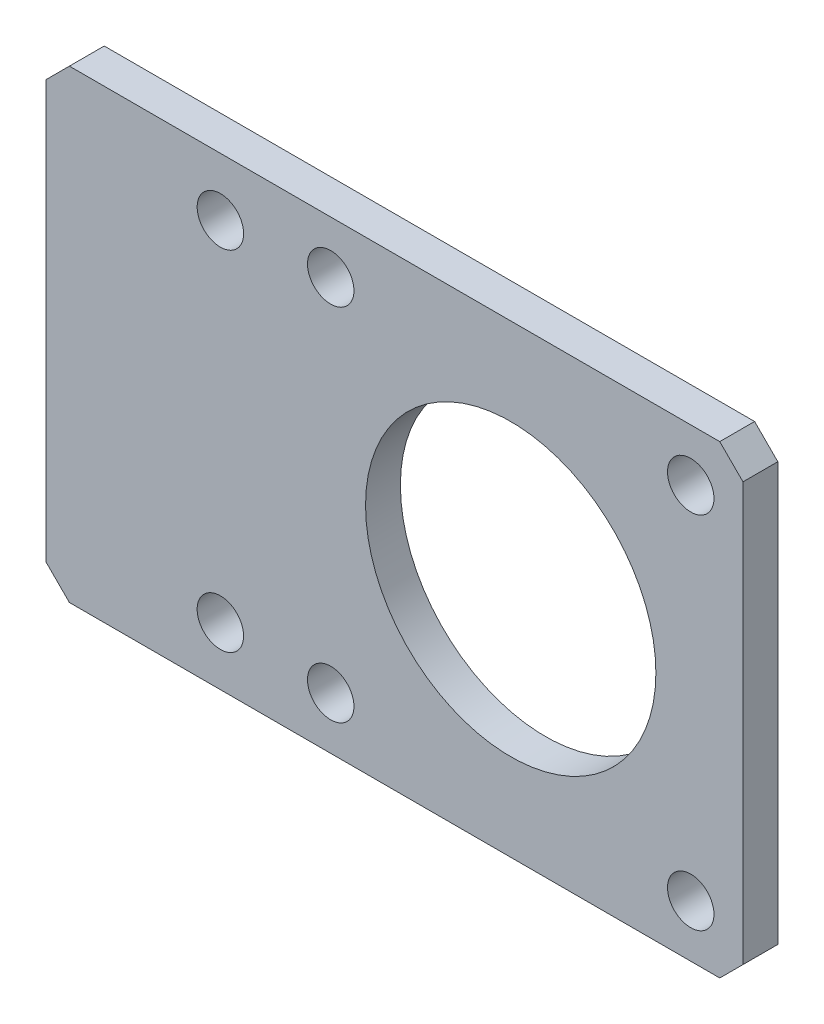
ISO-10303-21;
HEADER;
FILE_DESCRIPTION(('STEP AP214'),'2;1');
FILE_NAME('part.step','',(''),(''),'','','');
FILE_SCHEMA(('AUTOMOTIVE_DESIGN { 1 0 10303 214 1 1 1 1 }'));
ENDSEC;
DATA;
#1=APPLICATION_CONTEXT('core data for automotive mechanical design processes');
#2=APPLICATION_PROTOCOL_DEFINITION('international standard','automotive_design',2000,#1);
#3=PRODUCT_CONTEXT('',#1,'mechanical');
#4=PRODUCT('Part','Part','',(#3));
#5=PRODUCT_RELATED_PRODUCT_CATEGORY('part','',(#4));
#6=PRODUCT_DEFINITION_FORMATION('','',#4);
#7=PRODUCT_DEFINITION_CONTEXT('part definition',#1,'design');
#8=PRODUCT_DEFINITION('design','',#6,#7);
#9=PRODUCT_DEFINITION_SHAPE('','',#8);
#10=(LENGTH_UNIT() NAMED_UNIT(*) SI_UNIT(.MILLI.,.METRE.));
#11=(NAMED_UNIT(*) PLANE_ANGLE_UNIT() SI_UNIT($,.RADIAN.));
#12=(NAMED_UNIT(*) SI_UNIT($,.STERADIAN.) SOLID_ANGLE_UNIT());
#13=UNCERTAINTY_MEASURE_WITH_UNIT(LENGTH_MEASURE(1.E-05),#10,'distance_accuracy_value','');
#14=(GEOMETRIC_REPRESENTATION_CONTEXT(3) GLOBAL_UNCERTAINTY_ASSIGNED_CONTEXT((#13)) GLOBAL_UNIT_ASSIGNED_CONTEXT((#10,
#11,#12)) REPRESENTATION_CONTEXT('',''));
#15=CARTESIAN_POINT('',(0.,0.,0.));
#16=DIRECTION('',(0.,0.,1.));
#17=DIRECTION('',(1.,0.,0.));
#18=AXIS2_PLACEMENT_3D('',#15,#16,#17);
#19=CARTESIAN_POINT('',(0.,0.,3.));
#20=DIRECTION('',(1.,0.,0.));
#21=DIRECTION('',(0.,0.,-1.));
#22=AXIS2_PLACEMENT_3D('',#19,#20,#21);
#23=PLANE('',#22);
#24=DIRECTION('',(0.,-1.,0.));
#25=VECTOR('',#24,1.);
#26=CARTESIAN_POINT('',(0.,0.,0.));
#27=LINE('',#26,#25);
#28=CARTESIAN_POINT('',(0.,38.,0.));
#29=VERTEX_POINT('',#28);
#30=CARTESIAN_POINT('',(0.,2.00000000000001,0.));
#31=VERTEX_POINT('',#30);
#32=EDGE_CURVE('E125',#29,#31,#27,.T.);
#33=ORIENTED_EDGE('',*,*,#32,.T.);
#34=DIRECTION('',(0.,0.,1.));
#35=VECTOR('',#34,1.);
#36=CARTESIAN_POINT('',(0.,2.00000000000001,3.));
#37=LINE('',#36,#35);
#38=CARTESIAN_POINT('',(0.,2.00000000000001,3.));
#39=VERTEX_POINT('',#38);
#40=EDGE_CURVE('E103',#31,#39,#37,.T.);
#41=ORIENTED_EDGE('',*,*,#40,.T.);
#42=DIRECTION('',(0.,-1.,0.));
#43=VECTOR('',#42,1.);
#44=CARTESIAN_POINT('',(0.,0.,3.));
#45=LINE('',#44,#43);
#46=CARTESIAN_POINT('',(0.,38.,3.));
#47=VERTEX_POINT('',#46);
#48=EDGE_CURVE('E135',#47,#39,#45,.T.);
#49=ORIENTED_EDGE('',*,*,#48,.F.);
#50=DIRECTION('',(0.,0.,-1.));
#51=VECTOR('',#50,1.);
#52=CARTESIAN_POINT('',(0.,38.,3.));
#53=LINE('',#52,#51);
#54=EDGE_CURVE('E108',#47,#29,#53,.T.);
#55=ORIENTED_EDGE('',*,*,#54,.T.);
#56=EDGE_LOOP('',(#33,#41,#49,#55));
#57=FACE_BOUND('',#56,.T.);
#58=ADVANCED_FACE('F32',(#57),#23,.F.);
#59=CARTESIAN_POINT('',(0.,0.,3.));
#60=DIRECTION('',(0.,1.,0.));
#61=DIRECTION('',(0.,0.,1.));
#62=AXIS2_PLACEMENT_3D('',#59,#60,#61);
#63=PLANE('',#62);
#64=DIRECTION('',(1.,0.,0.));
#65=VECTOR('',#64,1.);
#66=CARTESIAN_POINT('',(0.,0.,3.));
#67=LINE('',#66,#65);
#68=CARTESIAN_POINT('',(1.99999999999999,0.,3.));
#69=VERTEX_POINT('',#68);
#70=CARTESIAN_POINT('',(58.,0.,3.));
#71=VERTEX_POINT('',#70);
#72=EDGE_CURVE('E118',#69,#71,#67,.T.);
#73=ORIENTED_EDGE('',*,*,#72,.F.);
#74=DIRECTION('',(0.,0.,-1.));
#75=VECTOR('',#74,1.);
#76=CARTESIAN_POINT('',(1.99999999999999,0.,3.));
#77=LINE('',#76,#75);
#78=CARTESIAN_POINT('',(1.99999999999999,0.,0.));
#79=VERTEX_POINT('',#78);
#80=EDGE_CURVE('E102',#69,#79,#77,.T.);
#81=ORIENTED_EDGE('',*,*,#80,.T.);
#82=DIRECTION('',(1.,0.,0.));
#83=VECTOR('',#82,1.);
#84=CARTESIAN_POINT('',(0.,0.,0.));
#85=LINE('',#84,#83);
#86=CARTESIAN_POINT('',(58.,0.,0.));
#87=VERTEX_POINT('',#86);
#88=EDGE_CURVE('E115',#79,#87,#85,.T.);
#89=ORIENTED_EDGE('',*,*,#88,.T.);
#90=DIRECTION('',(0.,0.,1.));
#91=VECTOR('',#90,1.);
#92=CARTESIAN_POINT('',(58.,0.,3.));
#93=LINE('',#92,#91);
#94=EDGE_CURVE('E120',#87,#71,#93,.T.);
#95=ORIENTED_EDGE('',*,*,#94,.T.);
#96=EDGE_LOOP('',(#73,#81,#89,#95));
#97=FACE_BOUND('',#96,.T.);
#98=ADVANCED_FACE('F114',(#97),#63,.F.);
#99=CARTESIAN_POINT('',(60.,0.,3.));
#100=DIRECTION('',(-1.,0.,0.));
#101=DIRECTION('',(0.,-1.,0.));
#102=AXIS2_PLACEMENT_3D('',#99,#100,#101);
#103=PLANE('',#102);
#104=DIRECTION('',(0.,1.,0.));
#105=VECTOR('',#104,1.);
#106=CARTESIAN_POINT('',(60.,0.,3.));
#107=LINE('',#106,#105);
#108=CARTESIAN_POINT('',(60.,1.99999999999999,3.));
#109=VERTEX_POINT('',#108);
#110=CARTESIAN_POINT('',(60.,38.,3.));
#111=VERTEX_POINT('',#110);
#112=EDGE_CURVE('E161',#109,#111,#107,.T.);
#113=ORIENTED_EDGE('',*,*,#112,.F.);
#114=DIRECTION('',(0.,0.,-1.));
#115=VECTOR('',#114,1.);
#116=CARTESIAN_POINT('',(60.,1.99999999999999,3.));
#117=LINE('',#116,#115);
#118=CARTESIAN_POINT('',(60.,2.00000000000001,0.));
#119=VERTEX_POINT('',#118);
#120=EDGE_CURVE('E154',#109,#119,#117,.T.);
#121=ORIENTED_EDGE('',*,*,#120,.T.);
#122=DIRECTION('',(0.,1.,0.));
#123=VECTOR('',#122,1.);
#124=CARTESIAN_POINT('',(60.,0.,0.));
#125=LINE('',#124,#123);
#126=CARTESIAN_POINT('',(60.,38.,0.));
#127=VERTEX_POINT('',#126);
#128=EDGE_CURVE('E124',#119,#127,#125,.T.);
#129=ORIENTED_EDGE('',*,*,#128,.T.);
#130=DIRECTION('',(0.,0.,1.));
#131=VECTOR('',#130,1.);
#132=CARTESIAN_POINT('',(60.,38.,3.));
#133=LINE('',#132,#131);
#134=EDGE_CURVE('E152',#127,#111,#133,.T.);
#135=ORIENTED_EDGE('',*,*,#134,.T.);
#136=EDGE_LOOP('',(#113,#121,#129,#135));
#137=FACE_BOUND('',#136,.T.);
#138=ADVANCED_FACE('F159',(#137),#103,.F.);
#139=CARTESIAN_POINT('',(0.,40.,3.));
#140=DIRECTION('',(0.,-1.,0.));
#141=DIRECTION('',(0.,0.,-1.));
#142=AXIS2_PLACEMENT_3D('',#139,#140,#141);
#143=PLANE('',#142);
#144=DIRECTION('',(-1.,0.,0.));
#145=VECTOR('',#144,1.);
#146=CARTESIAN_POINT('',(0.,40.,3.));
#147=LINE('',#146,#145);
#148=CARTESIAN_POINT('',(58.,40.,3.));
#149=VERTEX_POINT('',#148);
#150=CARTESIAN_POINT('',(2.00000000000002,40.,3.));
#151=VERTEX_POINT('',#150);
#152=EDGE_CURVE('E136',#149,#151,#147,.T.);
#153=ORIENTED_EDGE('',*,*,#152,.F.);
#154=DIRECTION('',(0.,0.,-1.));
#155=VECTOR('',#154,1.);
#156=CARTESIAN_POINT('',(58.,40.,3.));
#157=LINE('',#156,#155);
#158=CARTESIAN_POINT('',(58.,40.,0.));
#159=VERTEX_POINT('',#158);
#160=EDGE_CURVE('E11',#149,#159,#157,.T.);
#161=ORIENTED_EDGE('',*,*,#160,.T.);
#162=DIRECTION('',(-1.,0.,0.));
#163=VECTOR('',#162,1.);
#164=CARTESIAN_POINT('',(0.,40.,0.));
#165=LINE('',#164,#163);
#166=CARTESIAN_POINT('',(2.00000000000001,40.,0.));
#167=VERTEX_POINT('',#166);
#168=EDGE_CURVE('E128',#159,#167,#165,.T.);
#169=ORIENTED_EDGE('',*,*,#168,.T.);
#170=DIRECTION('',(0.,0.,1.));
#171=VECTOR('',#170,1.);
#172=CARTESIAN_POINT('',(2.00000000000002,40.,3.));
#173=LINE('',#172,#171);
#174=EDGE_CURVE('E40',#167,#151,#173,.T.);
#175=ORIENTED_EDGE('',*,*,#174,.T.);
#176=EDGE_LOOP('',(#153,#161,#169,#175));
#177=FACE_BOUND('',#176,.T.);
#178=ADVANCED_FACE('F168',(#177),#143,.F.);
#179=CARTESIAN_POINT('',(0.,0.,3.));
#180=DIRECTION('',(0.,0.,-1.));
#181=DIRECTION('',(-1.,0.,0.));
#182=AXIS2_PLACEMENT_3D('',#179,#180,#181);
#183=PLANE('',#182);
#184=CARTESIAN_POINT('',(15.,5.,3.));
#185=DIRECTION('',(0.,0.,1.));
#186=DIRECTION('',(1.,0.,0.));
#187=AXIS2_PLACEMENT_3D('',#184,#185,#186);
#188=CIRCLE('',#187,2.);
#189=CARTESIAN_POINT('',(17.,5.,3.));
#190=VERTEX_POINT('',#189);
#191=EDGE_CURVE('E211',#190,#190,#188,.T.);
#192=ORIENTED_EDGE('',*,*,#191,.F.);
#193=EDGE_LOOP('',(#192));
#194=FACE_BOUND('',#193,.T.);
#195=CARTESIAN_POINT('',(15.,35.,3.));
#196=DIRECTION('',(0.,0.,1.));
#197=DIRECTION('',(1.,0.,0.));
#198=AXIS2_PLACEMENT_3D('',#195,#196,#197);
#199=CIRCLE('',#198,2.);
#200=CARTESIAN_POINT('',(17.,35.,3.));
#201=VERTEX_POINT('',#200);
#202=EDGE_CURVE('E205',#201,#201,#199,.T.);
#203=ORIENTED_EDGE('',*,*,#202,.F.);
#204=EDGE_LOOP('',(#203));
#205=FACE_BOUND('',#204,.T.);
#206=CARTESIAN_POINT('',(40.,20.,3.));
#207=DIRECTION('',(0.,0.,1.));
#208=DIRECTION('',(1.,0.,0.));
#209=AXIS2_PLACEMENT_3D('',#206,#207,#208);
#210=CIRCLE('',#209,12.5);
#211=CARTESIAN_POINT('',(52.5,20.,3.));
#212=VERTEX_POINT('',#211);
#213=EDGE_CURVE('E199',#212,#212,#210,.T.);
#214=ORIENTED_EDGE('',*,*,#213,.F.);
#215=EDGE_LOOP('',(#214));
#216=FACE_BOUND('',#215,.T.);
#217=CARTESIAN_POINT('',(24.5,4.5,3.));
#218=DIRECTION('',(0.,0.,1.));
#219=DIRECTION('',(1.,0.,0.));
#220=AXIS2_PLACEMENT_3D('',#217,#218,#219);
#221=CIRCLE('',#220,2.);
#222=CARTESIAN_POINT('',(26.5,4.5,3.));
#223=VERTEX_POINT('',#222);
#224=EDGE_CURVE('E193',#223,#223,#221,.T.);
#225=ORIENTED_EDGE('',*,*,#224,.F.);
#226=EDGE_LOOP('',(#225));
#227=FACE_BOUND('',#226,.T.);
#228=CARTESIAN_POINT('',(55.5,4.5,3.));
#229=DIRECTION('',(0.,0.,1.));
#230=DIRECTION('',(1.,0.,0.));
#231=AXIS2_PLACEMENT_3D('',#228,#229,#230);
#232=CIRCLE('',#231,2.);
#233=CARTESIAN_POINT('',(57.5,4.5,3.));
#234=VERTEX_POINT('',#233);
#235=EDGE_CURVE('E187',#234,#234,#232,.T.);
#236=ORIENTED_EDGE('',*,*,#235,.F.);
#237=EDGE_LOOP('',(#236));
#238=FACE_BOUND('',#237,.T.);
#239=CARTESIAN_POINT('',(55.5,35.5,3.));
#240=DIRECTION('',(0.,0.,1.));
#241=DIRECTION('',(1.,0.,0.));
#242=AXIS2_PLACEMENT_3D('',#239,#240,#241);
#243=CIRCLE('',#242,2.);
#244=CARTESIAN_POINT('',(57.5,35.5,3.));
#245=VERTEX_POINT('',#244);
#246=EDGE_CURVE('E181',#245,#245,#243,.T.);
#247=ORIENTED_EDGE('',*,*,#246,.F.);
#248=EDGE_LOOP('',(#247));
#249=FACE_BOUND('',#248,.T.);
#250=CARTESIAN_POINT('',(24.5,35.5,3.));
#251=DIRECTION('',(0.,0.,1.));
#252=DIRECTION('',(1.,0.,0.));
#253=AXIS2_PLACEMENT_3D('',#250,#251,#252);
#254=CIRCLE('',#253,2.);
#255=CARTESIAN_POINT('',(26.5,35.5,3.));
#256=VERTEX_POINT('',#255);
#257=EDGE_CURVE('E175',#256,#256,#254,.T.);
#258=ORIENTED_EDGE('',*,*,#257,.F.);
#259=EDGE_LOOP('',(#258));
#260=FACE_BOUND('',#259,.T.);
#261=ORIENTED_EDGE('',*,*,#48,.T.);
#262=DIRECTION('',(-0.707106781186545,0.70710678118655,0.));
#263=VECTOR('',#262,1.);
#264=CARTESIAN_POINT('',(1.99999999999999,0.,3.));
#265=LINE('',#264,#263);
#266=EDGE_CURVE('E150',#39,#69,#265,.F.);
#267=ORIENTED_EDGE('',*,*,#266,.T.);
#268=ORIENTED_EDGE('',*,*,#72,.T.);
#269=DIRECTION('',(-0.70710678118655,-0.707106781186545,0.));
#270=VECTOR('',#269,1.);
#271=CARTESIAN_POINT('',(60.,1.99999999999999,3.));
#272=LINE('',#271,#270);
#273=EDGE_CURVE('E148',#71,#109,#272,.F.);
#274=ORIENTED_EDGE('',*,*,#273,.T.);
#275=ORIENTED_EDGE('',*,*,#112,.T.);
#276=DIRECTION('',(0.707106781186546,-0.707106781186549,0.));
#277=VECTOR('',#276,1.);
#278=CARTESIAN_POINT('',(58.,40.,3.));
#279=LINE('',#278,#277);
#280=EDGE_CURVE('E53',#111,#149,#279,.F.);
#281=ORIENTED_EDGE('',*,*,#280,.T.);
#282=ORIENTED_EDGE('',*,*,#152,.T.);
#283=DIRECTION('',(0.707106781186549,0.707106781186546,0.));
#284=VECTOR('',#283,1.);
#285=CARTESIAN_POINT('',(0.,38.,3.));
#286=LINE('',#285,#284);
#287=EDGE_CURVE('E145',#151,#47,#286,.F.);
#288=ORIENTED_EDGE('',*,*,#287,.T.);
#289=EDGE_LOOP('',(#261,#267,#268,#274,#275,#281,#282,#288));
#290=FACE_BOUND('',#289,.T.);
#291=ADVANCED_FACE('F226',(#194,#205,#216,#227,#238,#249,#260,#290),#183,.F.);
#292=CARTESIAN_POINT('',(0.,0.,0.));
#293=DIRECTION('',(0.,0.,-1.));
#294=DIRECTION('',(-1.,0.,0.));
#295=AXIS2_PLACEMENT_3D('',#292,#293,#294);
#296=PLANE('',#295);
#297=CARTESIAN_POINT('',(15.,5.,0.));
#298=DIRECTION('',(0.,0.,1.));
#299=DIRECTION('',(1.,0.,0.));
#300=AXIS2_PLACEMENT_3D('',#297,#298,#299);
#301=CIRCLE('',#300,2.);
#302=CARTESIAN_POINT('',(17.,5.,0.));
#303=VERTEX_POINT('',#302);
#304=EDGE_CURVE('E208',#303,#303,#301,.T.);
#305=ORIENTED_EDGE('',*,*,#304,.T.);
#306=EDGE_LOOP('',(#305));
#307=FACE_BOUND('',#306,.T.);
#308=CARTESIAN_POINT('',(15.,35.,0.));
#309=DIRECTION('',(0.,0.,1.));
#310=DIRECTION('',(1.,0.,0.));
#311=AXIS2_PLACEMENT_3D('',#308,#309,#310);
#312=CIRCLE('',#311,2.);
#313=CARTESIAN_POINT('',(17.,35.,0.));
#314=VERTEX_POINT('',#313);
#315=EDGE_CURVE('E202',#314,#314,#312,.T.);
#316=ORIENTED_EDGE('',*,*,#315,.T.);
#317=EDGE_LOOP('',(#316));
#318=FACE_BOUND('',#317,.T.);
#319=CARTESIAN_POINT('',(40.,20.,0.));
#320=DIRECTION('',(0.,0.,1.));
#321=DIRECTION('',(1.,0.,0.));
#322=AXIS2_PLACEMENT_3D('',#319,#320,#321);
#323=CIRCLE('',#322,12.5);
#324=CARTESIAN_POINT('',(52.5,20.,0.));
#325=VERTEX_POINT('',#324);
#326=EDGE_CURVE('E196',#325,#325,#323,.T.);
#327=ORIENTED_EDGE('',*,*,#326,.T.);
#328=EDGE_LOOP('',(#327));
#329=FACE_BOUND('',#328,.T.);
#330=CARTESIAN_POINT('',(24.5,4.5,0.));
#331=DIRECTION('',(0.,0.,1.));
#332=DIRECTION('',(1.,0.,0.));
#333=AXIS2_PLACEMENT_3D('',#330,#331,#332);
#334=CIRCLE('',#333,2.);
#335=CARTESIAN_POINT('',(26.5,4.5,0.));
#336=VERTEX_POINT('',#335);
#337=EDGE_CURVE('E190',#336,#336,#334,.T.);
#338=ORIENTED_EDGE('',*,*,#337,.T.);
#339=EDGE_LOOP('',(#338));
#340=FACE_BOUND('',#339,.T.);
#341=CARTESIAN_POINT('',(55.5,4.5,0.));
#342=DIRECTION('',(0.,0.,1.));
#343=DIRECTION('',(1.,0.,0.));
#344=AXIS2_PLACEMENT_3D('',#341,#342,#343);
#345=CIRCLE('',#344,2.);
#346=CARTESIAN_POINT('',(57.5,4.5,0.));
#347=VERTEX_POINT('',#346);
#348=EDGE_CURVE('E184',#347,#347,#345,.T.);
#349=ORIENTED_EDGE('',*,*,#348,.T.);
#350=EDGE_LOOP('',(#349));
#351=FACE_BOUND('',#350,.T.);
#352=CARTESIAN_POINT('',(55.5,35.5,0.));
#353=DIRECTION('',(0.,0.,1.));
#354=DIRECTION('',(1.,0.,0.));
#355=AXIS2_PLACEMENT_3D('',#352,#353,#354);
#356=CIRCLE('',#355,2.);
#357=CARTESIAN_POINT('',(57.5,35.5,0.));
#358=VERTEX_POINT('',#357);
#359=EDGE_CURVE('E178',#358,#358,#356,.T.);
#360=ORIENTED_EDGE('',*,*,#359,.T.);
#361=EDGE_LOOP('',(#360));
#362=FACE_BOUND('',#361,.T.);
#363=CARTESIAN_POINT('',(24.5,35.5,0.));
#364=DIRECTION('',(0.,0.,1.));
#365=DIRECTION('',(1.,0.,0.));
#366=AXIS2_PLACEMENT_3D('',#363,#364,#365);
#367=CIRCLE('',#366,2.);
#368=CARTESIAN_POINT('',(26.5,35.5,0.));
#369=VERTEX_POINT('',#368);
#370=EDGE_CURVE('E130',#369,#369,#367,.T.);
#371=ORIENTED_EDGE('',*,*,#370,.T.);
#372=EDGE_LOOP('',(#371));
#373=FACE_BOUND('',#372,.T.);
#374=ORIENTED_EDGE('',*,*,#88,.F.);
#375=DIRECTION('',(0.707106781186545,-0.70710678118655,0.));
#376=VECTOR('',#375,1.);
#377=CARTESIAN_POINT('',(1.,0.999999999999997,0.));
#378=LINE('',#377,#376);
#379=EDGE_CURVE('E98',#79,#31,#378,.F.);
#380=ORIENTED_EDGE('',*,*,#379,.T.);
#381=ORIENTED_EDGE('',*,*,#32,.F.);
#382=DIRECTION('',(-0.707106781186549,-0.707106781186546,0.));
#383=VECTOR('',#382,1.);
#384=CARTESIAN_POINT('',(-19.,19.0000000000001,0.));
#385=LINE('',#384,#383);
#386=EDGE_CURVE('E119',#29,#167,#385,.F.);
#387=ORIENTED_EDGE('',*,*,#386,.T.);
#388=ORIENTED_EDGE('',*,*,#168,.F.);
#389=DIRECTION('',(-0.707106781186546,0.707106781186549,0.));
#390=VECTOR('',#389,1.);
#391=CARTESIAN_POINT('',(49.0000000000001,48.9999999999999,0.));
#392=LINE('',#391,#390);
#393=EDGE_CURVE('E139',#159,#127,#392,.F.);
#394=ORIENTED_EDGE('',*,*,#393,.T.);
#395=ORIENTED_EDGE('',*,*,#128,.F.);
#396=DIRECTION('',(0.70710678118655,0.707106781186545,0.));
#397=VECTOR('',#396,1.);
#398=CARTESIAN_POINT('',(28.9999999999998,-29.,0.));
#399=LINE('',#398,#397);
#400=EDGE_CURVE('E109',#119,#87,#399,.F.);
#401=ORIENTED_EDGE('',*,*,#400,.T.);
#402=EDGE_LOOP('',(#374,#380,#381,#387,#388,#394,#395,#401));
#403=FACE_BOUND('',#402,.T.);
#404=ADVANCED_FACE('F122',(#307,#318,#329,#340,#351,#362,#373,#403),#296,.T.);
#405=CARTESIAN_POINT('',(24.5,35.5,0.));
#406=DIRECTION('',(0.,0.,1.));
#407=DIRECTION('',(1.,0.,0.));
#408=AXIS2_PLACEMENT_3D('',#405,#406,#407);
#409=CYLINDRICAL_SURFACE('',#408,2.);
#410=ORIENTED_EDGE('',*,*,#370,.F.);
#411=EDGE_LOOP('',(#410));
#412=FACE_BOUND('',#411,.T.);
#413=ORIENTED_EDGE('',*,*,#257,.T.);
#414=EDGE_LOOP('',(#413));
#415=FACE_BOUND('',#414,.T.);
#416=ADVANCED_FACE('F331',(#412,#415),#409,.F.);
#417=CARTESIAN_POINT('',(55.5,35.5,0.));
#418=DIRECTION('',(0.,0.,1.));
#419=DIRECTION('',(1.,0.,0.));
#420=AXIS2_PLACEMENT_3D('',#417,#418,#419);
#421=CYLINDRICAL_SURFACE('',#420,2.);
#422=ORIENTED_EDGE('',*,*,#359,.F.);
#423=EDGE_LOOP('',(#422));
#424=FACE_BOUND('',#423,.T.);
#425=ORIENTED_EDGE('',*,*,#246,.T.);
#426=EDGE_LOOP('',(#425));
#427=FACE_BOUND('',#426,.T.);
#428=ADVANCED_FACE('F322',(#424,#427),#421,.F.);
#429=CARTESIAN_POINT('',(55.5,4.5,0.));
#430=DIRECTION('',(0.,0.,1.));
#431=DIRECTION('',(1.,0.,0.));
#432=AXIS2_PLACEMENT_3D('',#429,#430,#431);
#433=CYLINDRICAL_SURFACE('',#432,2.);
#434=ORIENTED_EDGE('',*,*,#348,.F.);
#435=EDGE_LOOP('',(#434));
#436=FACE_BOUND('',#435,.T.);
#437=ORIENTED_EDGE('',*,*,#235,.T.);
#438=EDGE_LOOP('',(#437));
#439=FACE_BOUND('',#438,.T.);
#440=ADVANCED_FACE('F313',(#436,#439),#433,.F.);
#441=CARTESIAN_POINT('',(24.5,4.5,0.));
#442=DIRECTION('',(0.,0.,1.));
#443=DIRECTION('',(1.,0.,0.));
#444=AXIS2_PLACEMENT_3D('',#441,#442,#443);
#445=CYLINDRICAL_SURFACE('',#444,2.);
#446=ORIENTED_EDGE('',*,*,#337,.F.);
#447=EDGE_LOOP('',(#446));
#448=FACE_BOUND('',#447,.T.);
#449=ORIENTED_EDGE('',*,*,#224,.T.);
#450=EDGE_LOOP('',(#449));
#451=FACE_BOUND('',#450,.T.);
#452=ADVANCED_FACE('F304',(#448,#451),#445,.F.);
#453=CARTESIAN_POINT('',(40.,20.,0.));
#454=DIRECTION('',(0.,0.,1.));
#455=DIRECTION('',(1.,0.,0.));
#456=AXIS2_PLACEMENT_3D('',#453,#454,#455);
#457=CYLINDRICAL_SURFACE('',#456,12.5);
#458=ORIENTED_EDGE('',*,*,#326,.F.);
#459=EDGE_LOOP('',(#458));
#460=FACE_BOUND('',#459,.T.);
#461=ORIENTED_EDGE('',*,*,#213,.T.);
#462=EDGE_LOOP('',(#461));
#463=FACE_BOUND('',#462,.T.);
#464=ADVANCED_FACE('F295',(#460,#463),#457,.F.);
#465=CARTESIAN_POINT('',(15.,35.,0.));
#466=DIRECTION('',(0.,0.,1.));
#467=DIRECTION('',(1.,0.,0.));
#468=AXIS2_PLACEMENT_3D('',#465,#466,#467);
#469=CYLINDRICAL_SURFACE('',#468,2.);
#470=ORIENTED_EDGE('',*,*,#315,.F.);
#471=EDGE_LOOP('',(#470));
#472=FACE_BOUND('',#471,.T.);
#473=ORIENTED_EDGE('',*,*,#202,.T.);
#474=EDGE_LOOP('',(#473));
#475=FACE_BOUND('',#474,.T.);
#476=ADVANCED_FACE('F222',(#472,#475),#469,.F.);
#477=CARTESIAN_POINT('',(15.,5.,0.));
#478=DIRECTION('',(0.,0.,1.));
#479=DIRECTION('',(1.,0.,0.));
#480=AXIS2_PLACEMENT_3D('',#477,#478,#479);
#481=CYLINDRICAL_SURFACE('',#480,2.);
#482=ORIENTED_EDGE('',*,*,#304,.F.);
#483=EDGE_LOOP('',(#482));
#484=FACE_BOUND('',#483,.T.);
#485=ORIENTED_EDGE('',*,*,#191,.T.);
#486=EDGE_LOOP('',(#485));
#487=FACE_BOUND('',#486,.T.);
#488=ADVANCED_FACE('F219',(#484,#487),#481,.F.);
#489=CARTESIAN_POINT('',(1.99999999999999,0.,3.));
#490=DIRECTION('',(0.70710678118655,0.707106781186545,0.));
#491=DIRECTION('',(0.,0.,-1.));
#492=AXIS2_PLACEMENT_3D('',#489,#490,#491);
#493=PLANE('',#492);
#494=ORIENTED_EDGE('',*,*,#266,.F.);
#495=ORIENTED_EDGE('',*,*,#40,.F.);
#496=ORIENTED_EDGE('',*,*,#379,.F.);
#497=ORIENTED_EDGE('',*,*,#80,.F.);
#498=EDGE_LOOP('',(#494,#495,#496,#497));
#499=FACE_BOUND('',#498,.T.);
#500=ADVANCED_FACE('F101',(#499),#493,.F.);
#501=CARTESIAN_POINT('',(60.,1.99999999999999,3.));
#502=DIRECTION('',(-0.707106781186545,0.70710678118655,0.));
#503=DIRECTION('',(0.,0.,-1.));
#504=AXIS2_PLACEMENT_3D('',#501,#502,#503);
#505=PLANE('',#504);
#506=ORIENTED_EDGE('',*,*,#273,.F.);
#507=ORIENTED_EDGE('',*,*,#94,.F.);
#508=ORIENTED_EDGE('',*,*,#400,.F.);
#509=ORIENTED_EDGE('',*,*,#120,.F.);
#510=EDGE_LOOP('',(#506,#507,#508,#509));
#511=FACE_BOUND('',#510,.T.);
#512=ADVANCED_FACE('F249',(#511),#505,.F.);
#513=CARTESIAN_POINT('',(58.,40.,3.));
#514=DIRECTION('',(-0.707106781186549,-0.707106781186546,0.));
#515=DIRECTION('',(0.,0.,-1.));
#516=AXIS2_PLACEMENT_3D('',#513,#514,#515);
#517=PLANE('',#516);
#518=ORIENTED_EDGE('',*,*,#280,.F.);
#519=ORIENTED_EDGE('',*,*,#134,.F.);
#520=ORIENTED_EDGE('',*,*,#393,.F.);
#521=ORIENTED_EDGE('',*,*,#160,.F.);
#522=EDGE_LOOP('',(#518,#519,#520,#521));
#523=FACE_BOUND('',#522,.T.);
#524=ADVANCED_FACE('F167',(#523),#517,.F.);
#525=CARTESIAN_POINT('',(0.,38.,3.));
#526=DIRECTION('',(0.707106781186546,-0.707106781186549,0.));
#527=DIRECTION('',(0.,0.,-1.));
#528=AXIS2_PLACEMENT_3D('',#525,#526,#527);
#529=PLANE('',#528);
#530=ORIENTED_EDGE('',*,*,#287,.F.);
#531=ORIENTED_EDGE('',*,*,#174,.F.);
#532=ORIENTED_EDGE('',*,*,#386,.F.);
#533=ORIENTED_EDGE('',*,*,#54,.F.);
#534=EDGE_LOOP('',(#530,#531,#532,#533));
#535=FACE_BOUND('',#534,.T.);
#536=ADVANCED_FACE('F34',(#535),#529,.F.);
#537=CLOSED_SHELL('',(#58,#98,#138,#178,#291,#404,#416,#428,#440,#452,#464,#476,#488,#500,#512,
#524,#536));
#538=MANIFOLD_SOLID_BREP('B2',#537);
#539=ADVANCED_BREP_SHAPE_REPRESENTATION('',(#18,#538),#14);
#540=SHAPE_DEFINITION_REPRESENTATION(#9,#539);
ENDSEC;
END-ISO-10303-21;
